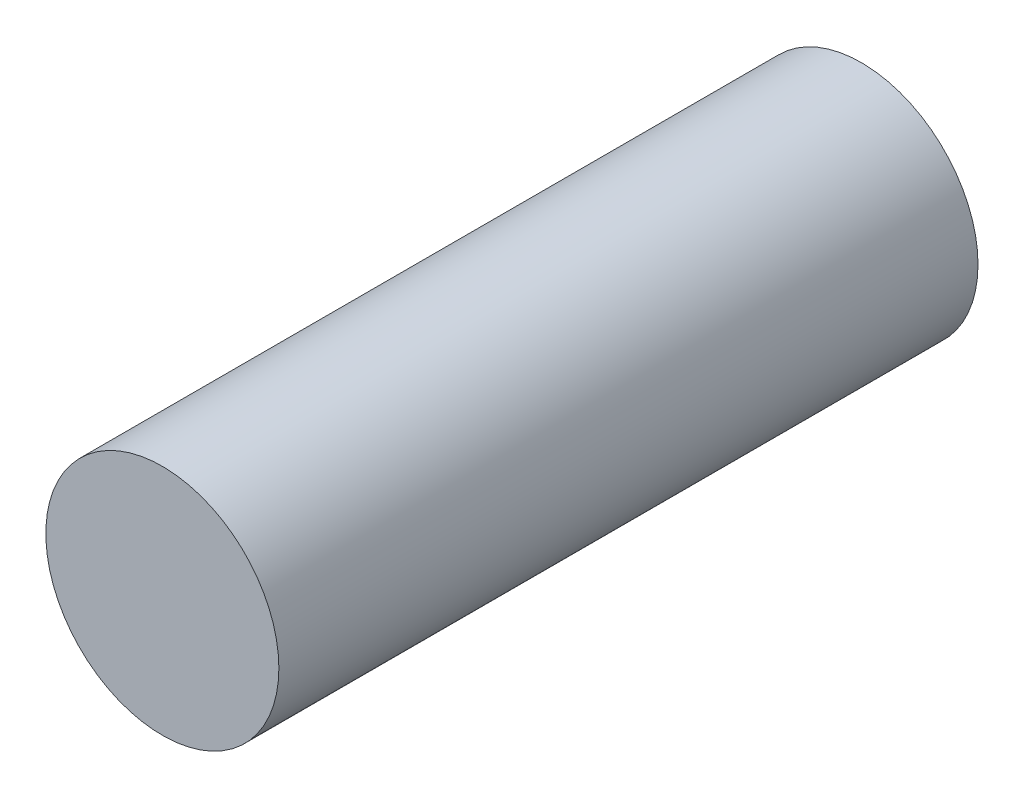
ISO-10303-21;
HEADER;
FILE_DESCRIPTION(('STEP AP214'),'2;1');
FILE_NAME('part.step','',(''),(''),'','','');
FILE_SCHEMA(('AUTOMOTIVE_DESIGN { 1 0 10303 214 1 1 1 1 }'));
ENDSEC;
DATA;
#1=APPLICATION_CONTEXT('core data for automotive mechanical design processes');
#2=APPLICATION_PROTOCOL_DEFINITION('international standard','automotive_design',2000,#1);
#3=PRODUCT_CONTEXT('',#1,'mechanical');
#4=PRODUCT('Part','Part','',(#3));
#5=PRODUCT_RELATED_PRODUCT_CATEGORY('part','',(#4));
#6=PRODUCT_DEFINITION_FORMATION('','',#4);
#7=PRODUCT_DEFINITION_CONTEXT('part definition',#1,'design');
#8=PRODUCT_DEFINITION('design','',#6,#7);
#9=PRODUCT_DEFINITION_SHAPE('','',#8);
#10=(LENGTH_UNIT() NAMED_UNIT(*) SI_UNIT(.MILLI.,.METRE.));
#11=(NAMED_UNIT(*) PLANE_ANGLE_UNIT() SI_UNIT($,.RADIAN.));
#12=(NAMED_UNIT(*) SI_UNIT($,.STERADIAN.) SOLID_ANGLE_UNIT());
#13=UNCERTAINTY_MEASURE_WITH_UNIT(LENGTH_MEASURE(1.E-05),#10,'distance_accuracy_value','');
#14=(GEOMETRIC_REPRESENTATION_CONTEXT(3) GLOBAL_UNCERTAINTY_ASSIGNED_CONTEXT((#13)) GLOBAL_UNIT_ASSIGNED_CONTEXT((#10,
#11,#12)) REPRESENTATION_CONTEXT('',''));
#15=CARTESIAN_POINT('',(0.,0.,0.));
#16=DIRECTION('',(0.,0.,1.));
#17=DIRECTION('',(1.,0.,0.));
#18=AXIS2_PLACEMENT_3D('',#15,#16,#17);
#19=CARTESIAN_POINT('',(0.,0.,15.));
#20=DIRECTION('',(0.,0.,-1.));
#21=DIRECTION('',(-1.,0.,0.));
#22=AXIS2_PLACEMENT_3D('',#19,#20,#21);
#23=CYLINDRICAL_SURFACE('',#22,5.);
#24=CARTESIAN_POINT('',(0.,0.,15.));
#25=DIRECTION('',(0.,0.,1.));
#26=DIRECTION('',(1.,0.,0.));
#27=AXIS2_PLACEMENT_3D('',#24,#25,#26);
#28=CIRCLE('',#27,5.);
#29=CARTESIAN_POINT('',(5.,0.,15.));
#30=VERTEX_POINT('',#29);
#31=EDGE_CURVE('E10',#30,#30,#28,.T.);
#32=ORIENTED_EDGE('',*,*,#31,.F.);
#33=EDGE_LOOP('',(#32));
#34=FACE_BOUND('',#33,.T.);
#35=CARTESIAN_POINT('',(0.,0.,-15.));
#36=DIRECTION('',(0.,0.,1.));
#37=DIRECTION('',(1.,0.,0.));
#38=AXIS2_PLACEMENT_3D('',#35,#36,#37);
#39=CIRCLE('',#38,5.);
#40=CARTESIAN_POINT('',(5.,0.,-15.));
#41=VERTEX_POINT('',#40);
#42=EDGE_CURVE('E38',#41,#41,#39,.T.);
#43=ORIENTED_EDGE('',*,*,#42,.T.);
#44=EDGE_LOOP('',(#43));
#45=FACE_BOUND('',#44,.T.);
#46=ADVANCED_FACE('F35',(#34,#45),#23,.T.);
#47=CARTESIAN_POINT('',(0.,0.,15.));
#48=DIRECTION('',(0.,0.,1.));
#49=DIRECTION('',(1.,0.,0.));
#50=AXIS2_PLACEMENT_3D('',#47,#48,#49);
#51=PLANE('',#50);
#52=ORIENTED_EDGE('',*,*,#31,.T.);
#53=EDGE_LOOP('',(#52));
#54=FACE_BOUND('',#53,.T.);
#55=ADVANCED_FACE('F50',(#54),#51,.T.);
#56=CARTESIAN_POINT('',(0.,0.,-15.));
#57=DIRECTION('',(0.,0.,1.));
#58=DIRECTION('',(1.,0.,0.));
#59=AXIS2_PLACEMENT_3D('',#56,#57,#58);
#60=PLANE('',#59);
#61=ORIENTED_EDGE('',*,*,#42,.F.);
#62=EDGE_LOOP('',(#61));
#63=FACE_BOUND('',#62,.T.);
#64=ADVANCED_FACE('F48',(#63),#60,.F.);
#65=CLOSED_SHELL('',(#46,#55,#64));
#66=MANIFOLD_SOLID_BREP('B2',#65);
#67=ADVANCED_BREP_SHAPE_REPRESENTATION('',(#18,#66),#14);
#68=SHAPE_DEFINITION_REPRESENTATION(#9,#67);
ENDSEC;
END-ISO-10303-21;
